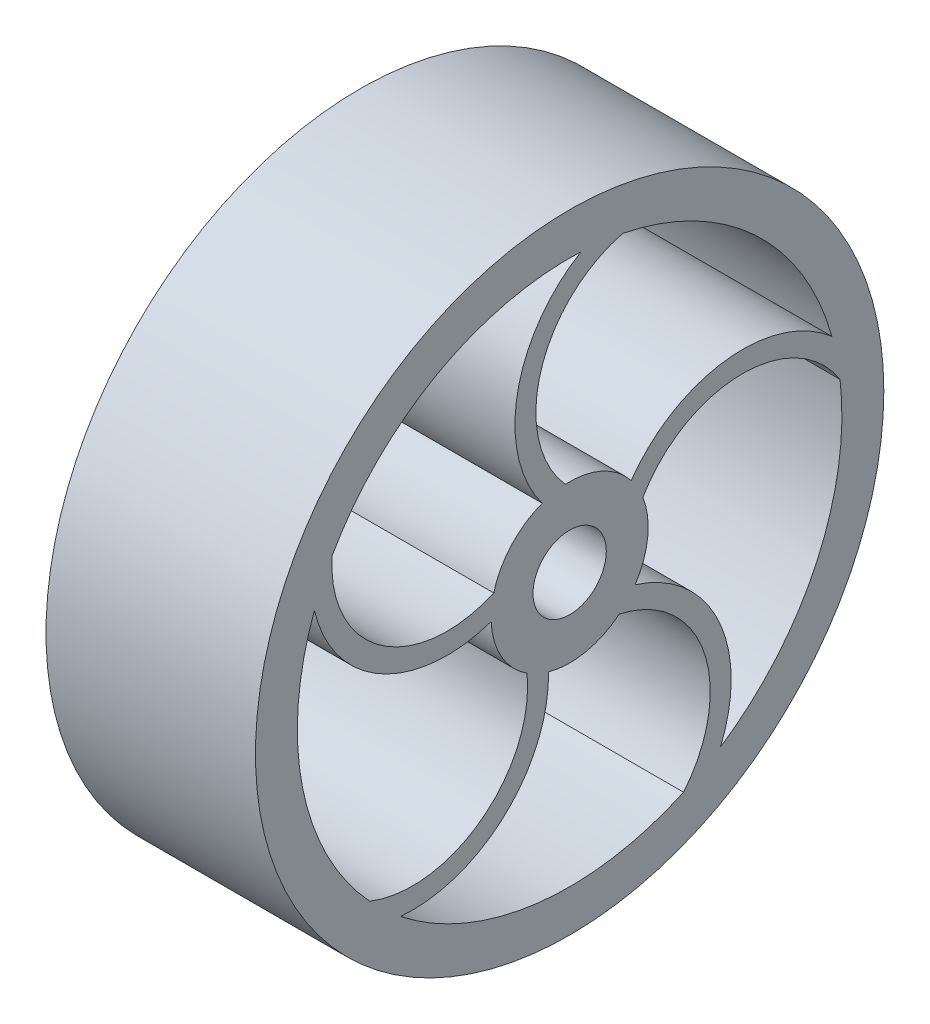
ISO-10303-21;
HEADER;
FILE_DESCRIPTION(('STEP AP214'),'2;1');
FILE_NAME('part.step','',(''),(''),'','','');
FILE_SCHEMA(('AUTOMOTIVE_DESIGN { 1 0 10303 214 1 1 1 1 }'));
ENDSEC;
DATA;
#1=APPLICATION_CONTEXT('core data for automotive mechanical design processes');
#2=APPLICATION_PROTOCOL_DEFINITION('international standard','automotive_design',2000,#1);
#3=PRODUCT_CONTEXT('',#1,'mechanical');
#4=PRODUCT('Part','Part','',(#3));
#5=PRODUCT_RELATED_PRODUCT_CATEGORY('part','',(#4));
#6=PRODUCT_DEFINITION_FORMATION('','',#4);
#7=PRODUCT_DEFINITION_CONTEXT('part definition',#1,'design');
#8=PRODUCT_DEFINITION('design','',#6,#7);
#9=PRODUCT_DEFINITION_SHAPE('','',#8);
#10=(LENGTH_UNIT() NAMED_UNIT(*) SI_UNIT(.MILLI.,.METRE.));
#11=(NAMED_UNIT(*) PLANE_ANGLE_UNIT() SI_UNIT($,.RADIAN.));
#12=(NAMED_UNIT(*) SI_UNIT($,.STERADIAN.) SOLID_ANGLE_UNIT());
#13=UNCERTAINTY_MEASURE_WITH_UNIT(LENGTH_MEASURE(1.E-05),#10,'distance_accuracy_value','');
#14=(GEOMETRIC_REPRESENTATION_CONTEXT(3) GLOBAL_UNCERTAINTY_ASSIGNED_CONTEXT((#13)) GLOBAL_UNIT_ASSIGNED_CONTEXT((#10,
#11,#12)) REPRESENTATION_CONTEXT('',''));
#15=CARTESIAN_POINT('',(0.,0.,0.));
#16=DIRECTION('',(0.,0.,1.));
#17=DIRECTION('',(1.,0.,0.));
#18=AXIS2_PLACEMENT_3D('',#15,#16,#17);
#19=CARTESIAN_POINT('',(-20.6066017177982,0.,0.));
#20=DIRECTION('',(1.,0.,0.));
#21=DIRECTION('',(0.,0.,-1.));
#22=AXIS2_PLACEMENT_3D('',#19,#20,#21);
#23=CYLINDRICAL_SURFACE('',#22,3.75);
#24=DIRECTION('',(1.,0.,0.));
#25=VECTOR('',#24,1.);
#26=CARTESIAN_POINT('',(-21.1056734173253,-2.90881639431108,-2.36670386491151));
#27=LINE('',#26,#25);
#28=CARTESIAN_POINT('',(-10.,-2.90881639431108,-2.36670386491151));
#29=VERTEX_POINT('',#28);
#30=CARTESIAN_POINT('',(0.,-2.90881639431108,-2.36670386491151));
#31=VERTEX_POINT('',#30);
#32=EDGE_CURVE('E72',#29,#31,#27,.T.);
#33=ORIENTED_EDGE('',*,*,#32,.T.);
#34=CARTESIAN_POINT('',(0.,0.,0.));
#35=DIRECTION('',(1.,0.,0.));
#36=DIRECTION('',(0.,0.,-1.));
#37=AXIS2_PLACEMENT_3D('',#34,#35,#36);
#38=CIRCLE('',#37,3.75);
#39=CARTESIAN_POINT('',(0.,-3.61232318996638,1.00678755019671));
#40=VERTEX_POINT('',#39);
#41=EDGE_CURVE('E228',#40,#31,#38,.T.);
#42=ORIENTED_EDGE('',*,*,#41,.F.);
#43=DIRECTION('',(1.,0.,0.));
#44=VECTOR('',#43,1.);
#45=CARTESIAN_POINT('',(-21.0859827786348,-3.61232318996638,1.00678755019671));
#46=LINE('',#45,#44);
#47=CARTESIAN_POINT('',(-10.,-3.61232318996638,1.00678755019671));
#48=VERTEX_POINT('',#47);
#49=EDGE_CURVE('E301',#48,#40,#46,.T.);
#50=ORIENTED_EDGE('',*,*,#49,.F.);
#51=CARTESIAN_POINT('',(-10.,0.,0.));
#52=DIRECTION('',(1.,0.,0.));
#53=DIRECTION('',(0.,0.,-1.));
#54=AXIS2_PLACEMENT_3D('',#51,#52,#53);
#55=CIRCLE('',#54,3.75);
#56=EDGE_CURVE('E369',#29,#48,#55,.F.);
#57=ORIENTED_EDGE('',*,*,#56,.F.);
#58=EDGE_LOOP('',(#33,#42,#50,#57));
#59=FACE_BOUND('',#58,.T.);
#60=ADVANCED_FACE('F45',(#59),#23,.T.);
#61=DIRECTION('',(1.,0.,0.));
#62=VECTOR('',#61,1.);
#63=CARTESIAN_POINT('',(-21.1056734173253,-2.07378111501374,-3.12440904604573));
#64=LINE('',#63,#62);
#65=CARTESIAN_POINT('',(-10.,-2.07378111501374,-3.12440904604573));
#66=VERTEX_POINT('',#65);
#67=CARTESIAN_POINT('',(0.,-2.07378111501374,-3.12440904604573));
#68=VERTEX_POINT('',#67);
#69=EDGE_CURVE('E257',#66,#68,#64,.T.);
#70=ORIENTED_EDGE('',*,*,#69,.F.);
#71=CARTESIAN_POINT('',(-10.,1.35199543350645,-3.49780050142625));
#72=VERTEX_POINT('',#71);
#73=EDGE_CURVE('E260',#72,#66,#55,.F.);
#74=ORIENTED_EDGE('',*,*,#73,.F.);
#75=DIRECTION('',(1.,0.,0.));
#76=VECTOR('',#75,1.);
#77=CARTESIAN_POINT('',(-20.6513714557364,1.35199543350645,-3.49780050142625));
#78=LINE('',#77,#76);
#79=CARTESIAN_POINT('',(0.,1.35199543350645,-3.49780050142625));
#80=VERTEX_POINT('',#79);
#81=EDGE_CURVE('E259',#72,#80,#78,.T.);
#82=ORIENTED_EDGE('',*,*,#81,.T.);
#83=EDGE_CURVE('E222',#68,#80,#38,.T.);
#84=ORIENTED_EDGE('',*,*,#83,.F.);
#85=EDGE_LOOP('',(#70,#74,#82,#84));
#86=FACE_BOUND('',#85,.T.);
#87=ADVANCED_FACE('F255',(#86),#23,.T.);
#88=DIRECTION('',(1.,0.,0.));
#89=VECTOR('',#88,1.);
#90=CARTESIAN_POINT('',(-20.6513714557364,2.33065597566025,-2.93777853541059));
#91=LINE('',#90,#89);
#92=CARTESIAN_POINT('',(-10.,2.33065597566025,-2.93777853541059));
#93=VERTEX_POINT('',#92);
#94=CARTESIAN_POINT('',(0.,2.33065597566025,-2.93777853541059));
#95=VERTEX_POINT('',#94);
#96=EDGE_CURVE('E266',#93,#95,#91,.T.);
#97=ORIENTED_EDGE('',*,*,#96,.F.);
#98=CARTESIAN_POINT('',(-10.,3.7443955248527,0.204944269163687));
#99=VERTEX_POINT('',#98);
#100=EDGE_CURVE('E55',#99,#93,#55,.F.);
#101=ORIENTED_EDGE('',*,*,#100,.F.);
#102=DIRECTION('',(1.,0.,0.));
#103=VECTOR('',#102,1.);
#104=CARTESIAN_POINT('',(-20.7843497110714,3.74439552485271,0.204944269163687));
#105=LINE('',#104,#103);
#106=CARTESIAN_POINT('',(0.,3.74439552485271,0.204944269163687));
#107=VERTEX_POINT('',#106);
#108=EDGE_CURVE('E199',#99,#107,#105,.T.);
#109=ORIENTED_EDGE('',*,*,#108,.T.);
#110=EDGE_CURVE('E216',#95,#107,#38,.T.);
#111=ORIENTED_EDGE('',*,*,#110,.F.);
#112=EDGE_LOOP('',(#97,#101,#109,#111));
#113=FACE_BOUND('',#112,.T.);
#114=ADVANCED_FACE('F389',(#113),#23,.T.);
#115=DIRECTION('',(1.,0.,0.));
#116=VECTOR('',#115,1.);
#117=CARTESIAN_POINT('',(-21.0859827786348,-3.1497428322236,2.03509707160521));
#118=LINE('',#117,#116);
#119=CARTESIAN_POINT('',(-10.,-3.1497428322236,2.0350970716052));
#120=VERTEX_POINT('',#119);
#121=CARTESIAN_POINT('',(0.,-3.1497428322236,2.03509707160521));
#122=VERTEX_POINT('',#121);
#123=EDGE_CURVE('E64',#120,#122,#118,.T.);
#124=ORIENTED_EDGE('',*,*,#123,.T.);
#125=CARTESIAN_POINT('',(0.,-0.15875739473491,3.74663797151753));
#126=VERTEX_POINT('',#125);
#127=EDGE_CURVE('E218',#126,#122,#38,.T.);
#128=ORIENTED_EDGE('',*,*,#127,.F.);
#129=DIRECTION('',(1.,0.,0.));
#130=VECTOR('',#129,1.);
#131=CARTESIAN_POINT('',(-20.9738852147441,-0.15875739473491,3.74663797151753));
#132=LINE('',#131,#130);
#133=CARTESIAN_POINT('',(-10.,-0.15875739473491,3.74663797151753));
#134=VERTEX_POINT('',#133);
#135=EDGE_CURVE('E343',#134,#126,#132,.T.);
#136=ORIENTED_EDGE('',*,*,#135,.F.);
#137=EDGE_CURVE('E57',#120,#134,#55,.F.);
#138=ORIENTED_EDGE('',*,*,#137,.F.);
#139=EDGE_LOOP('',(#124,#128,#136,#138));
#140=FACE_BOUND('',#139,.T.);
#141=ADVANCED_FACE('F367',(#140),#23,.T.);
#142=CARTESIAN_POINT('',(-52.4264068711929,0.,0.));
#143=DIRECTION('',(1.,0.,0.));
#144=DIRECTION('',(0.,0.,-1.));
#145=AXIS2_PLACEMENT_3D('',#142,#143,#144);
#146=CYLINDRICAL_SURFACE('',#145,13.);
#147=CARTESIAN_POINT('',(0.,0.,0.));
#148=DIRECTION('',(1.,0.,0.));
#149=DIRECTION('',(0.,0.,-1.));
#150=AXIS2_PLACEMENT_3D('',#147,#148,#149);
#151=CIRCLE('',#150,13.);
#152=CARTESIAN_POINT('',(0.,-10.1902613710243,8.07208604947997));
#153=VERTEX_POINT('',#152);
#154=CARTESIAN_POINT('',(0.,-11.8075373648667,-5.43893936142667));
#155=VERTEX_POINT('',#154);
#156=EDGE_CURVE('E319',#153,#155,#151,.T.);
#157=ORIENTED_EDGE('',*,*,#156,.T.);
#158=DIRECTION('',(1.,0.,0.));
#159=VECTOR('',#158,1.);
#160=CARTESIAN_POINT('',(-21.1056734173253,-11.8075373648667,-5.43893936142667));
#161=LINE('',#160,#159);
#162=CARTESIAN_POINT('',(-10.,-11.8075373648667,-5.43893936142667));
#163=VERTEX_POINT('',#162);
#164=EDGE_CURVE('E418',#163,#155,#161,.T.);
#165=ORIENTED_EDGE('',*,*,#164,.F.);
#166=CARTESIAN_POINT('',(-10.,0.,0.));
#167=DIRECTION('',(1.,0.,0.));
#168=DIRECTION('',(0.,0.,-1.));
#169=AXIS2_PLACEMENT_3D('',#166,#167,#168);
#170=CIRCLE('',#169,13.);
#171=CARTESIAN_POINT('',(-10.,-10.1902613710243,8.07208604947997));
#172=VERTEX_POINT('',#171);
#173=EDGE_CURVE('E671',#163,#172,#170,.F.);
#174=ORIENTED_EDGE('',*,*,#173,.T.);
#175=DIRECTION('',(1.,0.,0.));
#176=VECTOR('',#175,1.);
#177=CARTESIAN_POINT('',(-21.0859827786348,-10.1902613710243,8.07208604947997));
#178=LINE('',#177,#176);
#179=EDGE_CURVE('E295',#172,#153,#178,.T.);
#180=ORIENTED_EDGE('',*,*,#179,.T.);
#181=EDGE_LOOP('',(#157,#165,#174,#180));
#182=FACE_BOUND('',#181,.T.);
#183=ADVANCED_FACE('F479',(#182),#146,.F.);
#184=CARTESIAN_POINT('',(-10.,1.52400901395807,-12.9103600463107));
#185=VERTEX_POINT('',#184);
#186=CARTESIAN_POINT('',(-10.,-10.8259739782222,-7.19710271031727));
#187=VERTEX_POINT('',#186);
#188=EDGE_CURVE('E668',#185,#187,#170,.F.);
#189=ORIENTED_EDGE('',*,*,#188,.T.);
#190=DIRECTION('',(1.,0.,0.));
#191=VECTOR('',#190,1.);
#192=CARTESIAN_POINT('',(-21.1056734173253,-10.8259739782222,-7.19710271031727));
#193=LINE('',#192,#191);
#194=CARTESIAN_POINT('',(0.,-10.8259739782222,-7.19710271031727));
#195=VERTEX_POINT('',#194);
#196=EDGE_CURVE('E410',#187,#195,#193,.T.);
#197=ORIENTED_EDGE('',*,*,#196,.T.);
#198=CARTESIAN_POINT('',(0.,1.52400901395807,-12.9103600463107));
#199=VERTEX_POINT('',#198);
#200=EDGE_CURVE('E445',#195,#199,#151,.T.);
#201=ORIENTED_EDGE('',*,*,#200,.T.);
#202=DIRECTION('',(1.,0.,0.));
#203=VECTOR('',#202,1.);
#204=CARTESIAN_POINT('',(-20.6513714557364,1.52400901395807,-12.9103600463107));
#205=LINE('',#204,#203);
#206=EDGE_CURVE('E265',#185,#199,#205,.T.);
#207=ORIENTED_EDGE('',*,*,#206,.F.);
#208=EDGE_LOOP('',(#189,#197,#201,#207));
#209=FACE_BOUND('',#208,.T.);
#210=ADVANCED_FACE('F484',(#209),#146,.F.);
#211=CARTESIAN_POINT('',(-10.,12.749426734654,-2.54010195419192));
#212=VERTEX_POINT('',#211);
#213=CARTESIAN_POINT('',(-10.,3.49944149116118,-12.52014014498));
#214=VERTEX_POINT('',#213);
#215=EDGE_CURVE('E326',#212,#214,#170,.F.);
#216=ORIENTED_EDGE('',*,*,#215,.T.);
#217=DIRECTION('',(1.,0.,0.));
#218=VECTOR('',#217,1.);
#219=CARTESIAN_POINT('',(-20.6513714557364,3.49944149116118,-12.52014014498));
#220=LINE('',#219,#218);
#221=CARTESIAN_POINT('',(0.,3.49944149116118,-12.52014014498));
#222=VERTEX_POINT('',#221);
#223=EDGE_CURVE('E273',#214,#222,#220,.T.);
#224=ORIENTED_EDGE('',*,*,#223,.T.);
#225=CARTESIAN_POINT('',(0.,12.749426734654,-2.54010195419192));
#226=VERTEX_POINT('',#225);
#227=EDGE_CURVE('E398',#222,#226,#151,.T.);
#228=ORIENTED_EDGE('',*,*,#227,.T.);
#229=DIRECTION('',(1.,0.,0.));
#230=VECTOR('',#229,1.);
#231=CARTESIAN_POINT('',(-20.7843497110714,12.749426734654,-2.54010195419192));
#232=LINE('',#231,#230);
#233=EDGE_CURVE('E432',#212,#226,#232,.T.);
#234=ORIENTED_EDGE('',*,*,#233,.F.);
#235=EDGE_LOOP('',(#216,#224,#228,#234));
#236=FACE_BOUND('',#235,.T.);
#237=ADVANCED_FACE('F443',(#236),#146,.F.);
#238=CARTESIAN_POINT('',(0.,4.52804609668409,12.1859262490097));
#239=VERTEX_POINT('',#238);
#240=CARTESIAN_POINT('',(0.,-8.82146842888001,9.54891065819936));
#241=VERTEX_POINT('',#240);
#242=EDGE_CURVE('E315',#239,#241,#151,.T.);
#243=ORIENTED_EDGE('',*,*,#242,.T.);
#244=DIRECTION('',(1.,0.,0.));
#245=VECTOR('',#244,1.);
#246=CARTESIAN_POINT('',(-21.0859827786348,-8.82146842888001,9.54891065819936));
#247=LINE('',#246,#245);
#248=CARTESIAN_POINT('',(-10.,-8.82146842888001,9.54891065819936));
#249=VERTEX_POINT('',#248);
#250=EDGE_CURVE('E287',#249,#241,#247,.T.);
#251=ORIENTED_EDGE('',*,*,#250,.F.);
#252=CARTESIAN_POINT('',(-10.,4.52804609668409,12.1859262490097));
#253=VERTEX_POINT('',#252);
#254=EDGE_CURVE('E323',#249,#253,#170,.F.);
#255=ORIENTED_EDGE('',*,*,#254,.T.);
#256=DIRECTION('',(1.,0.,0.));
#257=VECTOR('',#256,1.);
#258=CARTESIAN_POINT('',(-20.9738852147441,4.52804609668409,12.1859262490097));
#259=LINE('',#258,#257);
#260=EDGE_CURVE('E337',#253,#239,#259,.T.);
#261=ORIENTED_EDGE('',*,*,#260,.T.);
#262=EDGE_LOOP('',(#243,#251,#255,#261));
#263=FACE_BOUND('',#262,.T.);
#264=ADVANCED_FACE('F363',(#263),#146,.F.);
#265=DIRECTION('',(1.,0.,0.));
#266=VECTOR('',#265,1.);
#267=CARTESIAN_POINT('',(-20.7843497110714,3.51420572405481,1.30876205974211));
#268=LINE('',#267,#266);
#269=CARTESIAN_POINT('',(-10.,3.51420572405481,1.30876205974211));
#270=VERTEX_POINT('',#269);
#271=CARTESIAN_POINT('',(0.,3.51420572405481,1.30876205974211));
#272=VERTEX_POINT('',#271);
#273=EDGE_CURVE('E188',#270,#272,#268,.T.);
#274=ORIENTED_EDGE('',*,*,#273,.F.);
#275=CARTESIAN_POINT('',(-10.,0.962168268175556,3.6244630255689));
#276=VERTEX_POINT('',#275);
#277=EDGE_CURVE('E11',#276,#270,#55,.F.);
#278=ORIENTED_EDGE('',*,*,#277,.F.);
#279=DIRECTION('',(1.,0.,0.));
#280=VECTOR('',#279,1.);
#281=CARTESIAN_POINT('',(-20.9738852147441,0.962168268175556,3.6244630255689));
#282=LINE('',#281,#280);
#283=CARTESIAN_POINT('',(0.,0.962168268175556,3.6244630255689));
#284=VERTEX_POINT('',#283);
#285=EDGE_CURVE('E214',#276,#284,#282,.T.);
#286=ORIENTED_EDGE('',*,*,#285,.T.);
#287=EDGE_CURVE('E207',#272,#284,#38,.T.);
#288=ORIENTED_EDGE('',*,*,#287,.F.);
#289=EDGE_LOOP('',(#274,#278,#286,#288));
#290=FACE_BOUND('',#289,.T.);
#291=ADVANCED_FACE('F47',(#290),#23,.T.);
#292=CARTESIAN_POINT('',(0.,0.,0.));
#293=DIRECTION('',(1.,0.,0.));
#294=DIRECTION('',(0.,0.,-1.));
#295=AXIS2_PLACEMENT_3D('',#292,#293,#294);
#296=PLANE('',#295);
#297=ORIENTED_EDGE('',*,*,#41,.T.);
#298=CARTESIAN_POINT('',(0.,-8.28659443166286,-1.21366293720046));
#299=DIRECTION('',(-1.,0.,0.));
#300=DIRECTION('',(0.,0.587785252292469,0.809016994374951));
#301=AXIS2_PLACEMENT_3D('',#298,#299,#300);
#302=CIRCLE('',#301,5.5);
#303=EDGE_CURVE('E413',#31,#155,#302,.T.);
#304=ORIENTED_EDGE('',*,*,#303,.T.);
#305=ORIENTED_EDGE('',*,*,#156,.F.);
#306=CARTESIAN_POINT('',(0.,-3.71496054988702,7.50597715909016));
#307=DIRECTION('',(1.,0.,0.));
#308=DIRECTION('',(0.,0.951056516295155,-0.309016994374945));
#309=AXIS2_PLACEMENT_3D('',#306,#307,#308);
#310=CIRCLE('',#309,6.5);
#311=EDGE_CURVE('E288',#153,#40,#310,.T.);
#312=ORIENTED_EDGE('',*,*,#311,.T.);
#313=EDGE_LOOP('',(#297,#304,#305,#312));
#314=FACE_BOUND('',#313,.T.);
#315=ORIENTED_EDGE('',*,*,#83,.T.);
#316=CARTESIAN_POINT('',(0.,-1.4064364598662,-8.25606210516606));
#317=DIRECTION('',(-1.,0.,0.));
#318=DIRECTION('',(0.,-0.58778525229248,0.809016994374942));
#319=AXIS2_PLACEMENT_3D('',#316,#317,#318);
#320=CIRCLE('',#319,5.5);
#321=EDGE_CURVE('E249',#80,#199,#320,.T.);
#322=ORIENTED_EDGE('',*,*,#321,.T.);
#323=ORIENTED_EDGE('',*,*,#200,.F.);
#324=CARTESIAN_POINT('',(0.,-8.28659443166286,-1.21366293720046));
#325=DIRECTION('',(1.,0.,0.));
#326=DIRECTION('',(0.,0.587785252292469,0.809016994374951));
#327=AXIS2_PLACEMENT_3D('',#324,#325,#326);
#328=CIRCLE('',#327,6.5);
#329=EDGE_CURVE('E251',#195,#68,#328,.T.);
#330=ORIENTED_EDGE('',*,*,#329,.T.);
#331=EDGE_LOOP('',(#315,#322,#323,#330));
#332=FACE_BOUND('',#331,.T.);
#333=ORIENTED_EDGE('',*,*,#110,.T.);
#334=CARTESIAN_POINT('',(0.,7.41736889644848,-3.88886405702213));
#335=DIRECTION('',(-1.,0.,0.));
#336=DIRECTION('',(0.,-0.95105651629515,-0.309016994374958));
#337=AXIS2_PLACEMENT_3D('',#334,#335,#336);
#338=CIRCLE('',#337,5.5);
#339=EDGE_CURVE('E211',#107,#226,#338,.T.);
#340=ORIENTED_EDGE('',*,*,#339,.T.);
#341=ORIENTED_EDGE('',*,*,#227,.F.);
#342=CARTESIAN_POINT('',(0.,-1.4064364598662,-8.25606210516606));
#343=DIRECTION('',(1.,0.,0.));
#344=DIRECTION('',(0.,-0.58778525229248,0.809016994374942));
#345=AXIS2_PLACEMENT_3D('',#342,#343,#344);
#346=CIRCLE('',#345,6.5);
#347=EDGE_CURVE('E395',#222,#95,#346,.T.);
#348=ORIENTED_EDGE('',*,*,#347,.T.);
#349=EDGE_LOOP('',(#333,#340,#341,#348));
#350=FACE_BOUND('',#349,.T.);
#351=ORIENTED_EDGE('',*,*,#127,.T.);
#352=CARTESIAN_POINT('',(0.,-3.71496054988702,7.50597715909016));
#353=DIRECTION('',(-1.,0.,0.));
#354=DIRECTION('',(0.,0.951056516295155,-0.309016994374945));
#355=AXIS2_PLACEMENT_3D('',#352,#353,#354);
#356=CIRCLE('',#355,5.5);
#357=EDGE_CURVE('E291',#122,#241,#356,.T.);
#358=ORIENTED_EDGE('',*,*,#357,.T.);
#359=ORIENTED_EDGE('',*,*,#242,.F.);
#360=CARTESIAN_POINT('',(0.,5.9906225449677,5.85261194029851));
#361=DIRECTION('',(1.,0.,0.));
#362=DIRECTION('',(0.,0.,-1.));
#363=AXIS2_PLACEMENT_3D('',#360,#361,#362);
#364=CIRCLE('',#363,6.5);
#365=EDGE_CURVE('E313',#239,#126,#364,.T.);
#366=ORIENTED_EDGE('',*,*,#365,.T.);
#367=EDGE_LOOP('',(#351,#358,#359,#366));
#368=FACE_BOUND('',#367,.T.);
#369=CARTESIAN_POINT('',(0.,0.,0.));
#370=DIRECTION('',(1.,0.,0.));
#371=DIRECTION('',(0.,0.,-1.));
#372=AXIS2_PLACEMENT_3D('',#369,#370,#371);
#373=CIRCLE('',#372,1.75);
#374=CARTESIAN_POINT('',(0.,0.,-1.75));
#375=VERTEX_POINT('',#374);
#376=EDGE_CURVE('E217',#375,#375,#373,.T.);
#377=ORIENTED_EDGE('',*,*,#376,.F.);
#378=EDGE_LOOP('',(#377));
#379=FACE_BOUND('',#378,.T.);
#380=CARTESIAN_POINT('',(0.,7.41736889644848,-3.88886405702213));
#381=DIRECTION('',(1.,0.,0.));
#382=DIRECTION('',(0.,-0.95105651629515,-0.309016994374958));
#383=AXIS2_PLACEMENT_3D('',#380,#381,#382);
#384=CIRCLE('',#383,6.5);
#385=CARTESIAN_POINT('',(0.,12.9887477614014,-0.540769443192334));
#386=VERTEX_POINT('',#385);
#387=EDGE_CURVE('E192',#386,#272,#384,.T.);
#388=ORIENTED_EDGE('',*,*,#387,.T.);
#389=ORIENTED_EDGE('',*,*,#287,.T.);
#390=CARTESIAN_POINT('',(0.,5.9906225449677,5.85261194029851));
#391=DIRECTION('',(-1.,0.,0.));
#392=DIRECTION('',(0.,0.,-1.));
#393=AXIS2_PLACEMENT_3D('',#390,#391,#392);
#394=CIRCLE('',#393,5.5);
#395=CARTESIAN_POINT('',(0.,6.35557004513479,11.3404907037299));
#396=VERTEX_POINT('',#395);
#397=EDGE_CURVE('E334',#284,#396,#394,.T.);
#398=ORIENTED_EDGE('',*,*,#397,.T.);
#399=EDGE_CURVE('E209',#386,#396,#151,.T.);
#400=ORIENTED_EDGE('',*,*,#399,.F.);
#401=EDGE_LOOP('',(#388,#389,#398,#400));
#402=FACE_BOUND('',#401,.T.);
#403=CARTESIAN_POINT('',(0.,0.,0.));
#404=DIRECTION('',(1.,0.,0.));
#405=DIRECTION('',(0.,0.,-1.));
#406=AXIS2_PLACEMENT_3D('',#403,#404,#405);
#407=CIRCLE('',#406,15.);
#408=CARTESIAN_POINT('',(0.,0.,-15.));
#409=VERTEX_POINT('',#408);
#410=EDGE_CURVE('E318',#409,#409,#407,.T.);
#411=ORIENTED_EDGE('',*,*,#410,.T.);
#412=EDGE_LOOP('',(#411));
#413=FACE_BOUND('',#412,.T.);
#414=ADVANCED_FACE('F204',(#314,#332,#350,#368,#379,#402,#413),#296,.T.);
#415=CARTESIAN_POINT('',(-20.6066017177982,0.,0.));
#416=DIRECTION('',(1.,0.,0.));
#417=DIRECTION('',(0.,0.,-1.));
#418=AXIS2_PLACEMENT_3D('',#415,#416,#417);
#419=CYLINDRICAL_SURFACE('',#418,1.75);
#420=CARTESIAN_POINT('',(-10.,0.,0.));
#421=DIRECTION('',(1.,0.,0.));
#422=DIRECTION('',(0.,0.,-1.));
#423=AXIS2_PLACEMENT_3D('',#420,#421,#422);
#424=CIRCLE('',#423,1.75);
#425=CARTESIAN_POINT('',(-10.,0.,-1.75));
#426=VERTEX_POINT('',#425);
#427=EDGE_CURVE('E49',#426,#426,#424,.F.);
#428=ORIENTED_EDGE('',*,*,#427,.T.);
#429=EDGE_LOOP('',(#428));
#430=FACE_BOUND('',#429,.T.);
#431=ORIENTED_EDGE('',*,*,#376,.T.);
#432=EDGE_LOOP('',(#431));
#433=FACE_BOUND('',#432,.T.);
#434=ADVANCED_FACE('F455',(#430,#433),#419,.F.);
#435=CARTESIAN_POINT('',(-10.,0.,0.));
#436=DIRECTION('',(1.,0.,0.));
#437=DIRECTION('',(0.,0.,-1.));
#438=AXIS2_PLACEMENT_3D('',#435,#436,#437);
#439=PLANE('',#438);
#440=ORIENTED_EDGE('',*,*,#73,.T.);
#441=CARTESIAN_POINT('',(-10.,-8.28659443166286,-1.21366293720046));
#442=DIRECTION('',(1.,0.,0.));
#443=DIRECTION('',(0.,0.,-1.));
#444=AXIS2_PLACEMENT_3D('',#441,#442,#443);
#445=CIRCLE('',#444,6.5);
#446=EDGE_CURVE('E292',#66,#187,#445,.F.);
#447=ORIENTED_EDGE('',*,*,#446,.T.);
#448=ORIENTED_EDGE('',*,*,#188,.F.);
#449=CARTESIAN_POINT('',(-10.,-1.4064364598662,-8.25606210516606));
#450=DIRECTION('',(1.,0.,0.));
#451=DIRECTION('',(0.,0.,-1.));
#452=AXIS2_PLACEMENT_3D('',#449,#450,#451);
#453=CIRCLE('',#452,5.5);
#454=EDGE_CURVE('E271',#185,#72,#453,.T.);
#455=ORIENTED_EDGE('',*,*,#454,.T.);
#456=EDGE_LOOP('',(#440,#447,#448,#455));
#457=FACE_BOUND('',#456,.T.);
#458=ORIENTED_EDGE('',*,*,#100,.T.);
#459=CARTESIAN_POINT('',(-10.,-1.4064364598662,-8.25606210516606));
#460=DIRECTION('',(1.,0.,0.));
#461=DIRECTION('',(0.,0.,-1.));
#462=AXIS2_PLACEMENT_3D('',#459,#460,#461);
#463=CIRCLE('',#462,6.5);
#464=EDGE_CURVE('E279',#93,#214,#463,.F.);
#465=ORIENTED_EDGE('',*,*,#464,.T.);
#466=ORIENTED_EDGE('',*,*,#215,.F.);
#467=CARTESIAN_POINT('',(-10.,7.41736889644848,-3.88886405702213));
#468=DIRECTION('',(1.,0.,0.));
#469=DIRECTION('',(0.,0.,-1.));
#470=AXIS2_PLACEMENT_3D('',#467,#468,#469);
#471=CIRCLE('',#470,5.5);
#472=EDGE_CURVE('E385',#212,#99,#471,.T.);
#473=ORIENTED_EDGE('',*,*,#472,.T.);
#474=EDGE_LOOP('',(#458,#465,#466,#473));
#475=FACE_BOUND('',#474,.T.);
#476=ORIENTED_EDGE('',*,*,#277,.T.);
#477=CARTESIAN_POINT('',(-10.,7.41736889644848,-3.88886405702213));
#478=DIRECTION('',(1.,0.,0.));
#479=DIRECTION('',(0.,0.,-1.));
#480=AXIS2_PLACEMENT_3D('',#477,#478,#479);
#481=CIRCLE('',#480,6.5);
#482=CARTESIAN_POINT('',(-10.,12.9887477614014,-0.540769443192334));
#483=VERTEX_POINT('',#482);
#484=EDGE_CURVE('E194',#270,#483,#481,.F.);
#485=ORIENTED_EDGE('',*,*,#484,.T.);
#486=CARTESIAN_POINT('',(-10.,6.35557004513479,11.3404907037299));
#487=VERTEX_POINT('',#486);
#488=EDGE_CURVE('E314',#487,#483,#170,.F.);
#489=ORIENTED_EDGE('',*,*,#488,.F.);
#490=CARTESIAN_POINT('',(-10.,5.9906225449677,5.85261194029851));
#491=DIRECTION('',(1.,0.,0.));
#492=DIRECTION('',(0.,0.,-1.));
#493=AXIS2_PLACEMENT_3D('',#490,#491,#492);
#494=CIRCLE('',#493,5.5);
#495=EDGE_CURVE('E327',#487,#276,#494,.T.);
#496=ORIENTED_EDGE('',*,*,#495,.T.);
#497=EDGE_LOOP('',(#476,#485,#489,#496));
#498=FACE_BOUND('',#497,.T.);
#499=ORIENTED_EDGE('',*,*,#56,.T.);
#500=CARTESIAN_POINT('',(-10.,-3.71496054988702,7.50597715909016));
#501=DIRECTION('',(1.,0.,0.));
#502=DIRECTION('',(0.,0.,-1.));
#503=AXIS2_PLACEMENT_3D('',#500,#501,#502);
#504=CIRCLE('',#503,6.5);
#505=EDGE_CURVE('E286',#48,#172,#504,.F.);
#506=ORIENTED_EDGE('',*,*,#505,.T.);
#507=ORIENTED_EDGE('',*,*,#173,.F.);
#508=CARTESIAN_POINT('',(-10.,-8.28659443166286,-1.21366293720046));
#509=DIRECTION('',(1.,0.,0.));
#510=DIRECTION('',(0.,0.,-1.));
#511=AXIS2_PLACEMENT_3D('',#508,#509,#510);
#512=CIRCLE('',#511,5.5);
#513=EDGE_CURVE('E409',#163,#29,#512,.T.);
#514=ORIENTED_EDGE('',*,*,#513,.T.);
#515=EDGE_LOOP('',(#499,#506,#507,#514));
#516=FACE_BOUND('',#515,.T.);
#517=CARTESIAN_POINT('',(-10.,-3.71496054988702,7.50597715909016));
#518=DIRECTION('',(1.,0.,0.));
#519=DIRECTION('',(0.,0.,-1.));
#520=AXIS2_PLACEMENT_3D('',#517,#518,#519);
#521=CIRCLE('',#520,5.5);
#522=EDGE_CURVE('E283',#249,#120,#521,.T.);
#523=ORIENTED_EDGE('',*,*,#522,.T.);
#524=ORIENTED_EDGE('',*,*,#137,.T.);
#525=CARTESIAN_POINT('',(-10.,5.9906225449677,5.85261194029851));
#526=DIRECTION('',(1.,0.,0.));
#527=DIRECTION('',(0.,0.,-1.));
#528=AXIS2_PLACEMENT_3D('',#525,#526,#527);
#529=CIRCLE('',#528,6.5);
#530=EDGE_CURVE('E224',#134,#253,#529,.F.);
#531=ORIENTED_EDGE('',*,*,#530,.T.);
#532=ORIENTED_EDGE('',*,*,#254,.F.);
#533=EDGE_LOOP('',(#523,#524,#531,#532));
#534=FACE_BOUND('',#533,.T.);
#535=ORIENTED_EDGE('',*,*,#427,.F.);
#536=EDGE_LOOP('',(#535));
#537=FACE_BOUND('',#536,.T.);
#538=CARTESIAN_POINT('',(-10.,0.,0.));
#539=DIRECTION('',(1.,0.,0.));
#540=DIRECTION('',(0.,0.,-1.));
#541=AXIS2_PLACEMENT_3D('',#538,#539,#540);
#542=CIRCLE('',#541,15.);
#543=CARTESIAN_POINT('',(-10.,0.,-15.));
#544=VERTEX_POINT('',#543);
#545=EDGE_CURVE('E309',#544,#544,#542,.F.);
#546=ORIENTED_EDGE('',*,*,#545,.T.);
#547=EDGE_LOOP('',(#546));
#548=FACE_BOUND('',#547,.T.);
#549=ADVANCED_FACE('F354',(#457,#475,#498,#516,#534,#537,#548),#439,.F.);
#550=CARTESIAN_POINT('',(-20.9738852147441,5.9906225449677,5.85261194029851));
#551=DIRECTION('',(1.,0.,0.));
#552=DIRECTION('',(0.,0.,-1.));
#553=AXIS2_PLACEMENT_3D('',#550,#551,#552);
#554=CYLINDRICAL_SURFACE('',#553,5.5);
#555=ORIENTED_EDGE('',*,*,#495,.F.);
#556=DIRECTION('',(1.,0.,0.));
#557=VECTOR('',#556,1.);
#558=CARTESIAN_POINT('',(-20.9738852147441,6.35557004513479,11.3404907037299));
#559=LINE('',#558,#557);
#560=EDGE_CURVE('E331',#487,#396,#559,.T.);
#561=ORIENTED_EDGE('',*,*,#560,.T.);
#562=ORIENTED_EDGE('',*,*,#397,.F.);
#563=ORIENTED_EDGE('',*,*,#285,.F.);
#564=EDGE_LOOP('',(#555,#561,#562,#563));
#565=FACE_BOUND('',#564,.T.);
#566=ADVANCED_FACE('F453',(#565),#554,.F.);
#567=CARTESIAN_POINT('',(-20.9738852147441,5.9906225449677,5.85261194029851));
#568=DIRECTION('',(1.,0.,0.));
#569=DIRECTION('',(0.,0.,-1.));
#570=AXIS2_PLACEMENT_3D('',#567,#568,#569);
#571=CYLINDRICAL_SURFACE('',#570,6.5);
#572=ORIENTED_EDGE('',*,*,#530,.F.);
#573=ORIENTED_EDGE('',*,*,#135,.T.);
#574=ORIENTED_EDGE('',*,*,#365,.F.);
#575=ORIENTED_EDGE('',*,*,#260,.F.);
#576=EDGE_LOOP('',(#572,#573,#574,#575));
#577=FACE_BOUND('',#576,.T.);
#578=ADVANCED_FACE('F360',(#577),#571,.T.);
#579=CARTESIAN_POINT('',(-52.4264068711929,0.,0.));
#580=DIRECTION('',(1.,0.,0.));
#581=DIRECTION('',(0.,0.,-1.));
#582=AXIS2_PLACEMENT_3D('',#579,#580,#581);
#583=CYLINDRICAL_SURFACE('',#582,15.);
#584=ORIENTED_EDGE('',*,*,#545,.F.);
#585=EDGE_LOOP('',(#584));
#586=FACE_BOUND('',#585,.T.);
#587=ORIENTED_EDGE('',*,*,#410,.F.);
#588=EDGE_LOOP('',(#587));
#589=FACE_BOUND('',#588,.T.);
#590=ADVANCED_FACE('F607',(#586,#589),#583,.T.);
#591=ORIENTED_EDGE('',*,*,#488,.T.);
#592=DIRECTION('',(1.,0.,0.));
#593=VECTOR('',#592,1.);
#594=CARTESIAN_POINT('',(-20.7843497110714,12.9887477614014,-0.540769443192334));
#595=LINE('',#594,#593);
#596=EDGE_CURVE('E200',#483,#386,#595,.T.);
#597=ORIENTED_EDGE('',*,*,#596,.T.);
#598=ORIENTED_EDGE('',*,*,#399,.T.);
#599=ORIENTED_EDGE('',*,*,#560,.F.);
#600=EDGE_LOOP('',(#591,#597,#598,#599));
#601=FACE_BOUND('',#600,.T.);
#602=ADVANCED_FACE('F450',(#601),#146,.F.);
#603=CARTESIAN_POINT('',(-21.0859827786348,-3.71496054988702,7.50597715909016));
#604=DIRECTION('',(1.,0.,0.));
#605=DIRECTION('',(0.,0.,-1.));
#606=AXIS2_PLACEMENT_3D('',#603,#604,#605);
#607=CYLINDRICAL_SURFACE('',#606,5.5);
#608=ORIENTED_EDGE('',*,*,#522,.F.);
#609=ORIENTED_EDGE('',*,*,#250,.T.);
#610=ORIENTED_EDGE('',*,*,#357,.F.);
#611=ORIENTED_EDGE('',*,*,#123,.F.);
#612=EDGE_LOOP('',(#608,#609,#610,#611));
#613=FACE_BOUND('',#612,.T.);
#614=ADVANCED_FACE('F365',(#613),#607,.F.);
#615=CARTESIAN_POINT('',(-21.0859827786348,-3.71496054988702,7.50597715909016));
#616=DIRECTION('',(1.,0.,0.));
#617=DIRECTION('',(0.,0.,-1.));
#618=AXIS2_PLACEMENT_3D('',#615,#616,#617);
#619=CYLINDRICAL_SURFACE('',#618,6.5);
#620=ORIENTED_EDGE('',*,*,#505,.F.);
#621=ORIENTED_EDGE('',*,*,#49,.T.);
#622=ORIENTED_EDGE('',*,*,#311,.F.);
#623=ORIENTED_EDGE('',*,*,#179,.F.);
#624=EDGE_LOOP('',(#620,#621,#622,#623));
#625=FACE_BOUND('',#624,.T.);
#626=ADVANCED_FACE('F542',(#625),#619,.T.);
#627=CARTESIAN_POINT('',(-20.7843497110714,7.41736889644848,-3.88886405702213));
#628=DIRECTION('',(1.,0.,0.));
#629=DIRECTION('',(0.,0.,-1.));
#630=AXIS2_PLACEMENT_3D('',#627,#628,#629);
#631=CYLINDRICAL_SURFACE('',#630,5.5);
#632=ORIENTED_EDGE('',*,*,#472,.F.);
#633=ORIENTED_EDGE('',*,*,#233,.T.);
#634=ORIENTED_EDGE('',*,*,#339,.F.);
#635=ORIENTED_EDGE('',*,*,#108,.F.);
#636=EDGE_LOOP('',(#632,#633,#634,#635));
#637=FACE_BOUND('',#636,.T.);
#638=ADVANCED_FACE('F440',(#637),#631,.F.);
#639=CARTESIAN_POINT('',(-20.7843497110714,7.41736889644848,-3.88886405702213));
#640=DIRECTION('',(1.,0.,0.));
#641=DIRECTION('',(0.,0.,-1.));
#642=AXIS2_PLACEMENT_3D('',#639,#640,#641);
#643=CYLINDRICAL_SURFACE('',#642,6.5);
#644=ORIENTED_EDGE('',*,*,#484,.F.);
#645=ORIENTED_EDGE('',*,*,#273,.T.);
#646=ORIENTED_EDGE('',*,*,#387,.F.);
#647=ORIENTED_EDGE('',*,*,#596,.F.);
#648=EDGE_LOOP('',(#644,#645,#646,#647));
#649=FACE_BOUND('',#648,.T.);
#650=ADVANCED_FACE('F190',(#649),#643,.T.);
#651=CARTESIAN_POINT('',(-20.6513714557364,-1.4064364598662,-8.25606210516606));
#652=DIRECTION('',(1.,0.,0.));
#653=DIRECTION('',(0.,0.,-1.));
#654=AXIS2_PLACEMENT_3D('',#651,#652,#653);
#655=CYLINDRICAL_SURFACE('',#654,5.5);
#656=ORIENTED_EDGE('',*,*,#454,.F.);
#657=ORIENTED_EDGE('',*,*,#206,.T.);
#658=ORIENTED_EDGE('',*,*,#321,.F.);
#659=ORIENTED_EDGE('',*,*,#81,.F.);
#660=EDGE_LOOP('',(#656,#657,#658,#659));
#661=FACE_BOUND('',#660,.T.);
#662=ADVANCED_FACE('F568',(#661),#655,.F.);
#663=CARTESIAN_POINT('',(-20.6513714557364,-1.4064364598662,-8.25606210516606));
#664=DIRECTION('',(1.,0.,0.));
#665=DIRECTION('',(0.,0.,-1.));
#666=AXIS2_PLACEMENT_3D('',#663,#664,#665);
#667=CYLINDRICAL_SURFACE('',#666,6.5);
#668=ORIENTED_EDGE('',*,*,#464,.F.);
#669=ORIENTED_EDGE('',*,*,#96,.T.);
#670=ORIENTED_EDGE('',*,*,#347,.F.);
#671=ORIENTED_EDGE('',*,*,#223,.F.);
#672=EDGE_LOOP('',(#668,#669,#670,#671));
#673=FACE_BOUND('',#672,.T.);
#674=ADVANCED_FACE('F394',(#673),#667,.T.);
#675=CARTESIAN_POINT('',(-21.1056734173253,-8.28659443166286,-1.21366293720046));
#676=DIRECTION('',(1.,0.,0.));
#677=DIRECTION('',(0.,0.,-1.));
#678=AXIS2_PLACEMENT_3D('',#675,#676,#677);
#679=CYLINDRICAL_SURFACE('',#678,5.5);
#680=ORIENTED_EDGE('',*,*,#513,.F.);
#681=ORIENTED_EDGE('',*,*,#164,.T.);
#682=ORIENTED_EDGE('',*,*,#303,.F.);
#683=ORIENTED_EDGE('',*,*,#32,.F.);
#684=EDGE_LOOP('',(#680,#681,#682,#683));
#685=FACE_BOUND('',#684,.T.);
#686=ADVANCED_FACE('F585',(#685),#679,.F.);
#687=CARTESIAN_POINT('',(-21.1056734173253,-8.28659443166286,-1.21366293720046));
#688=DIRECTION('',(1.,0.,0.));
#689=DIRECTION('',(0.,0.,-1.));
#690=AXIS2_PLACEMENT_3D('',#687,#688,#689);
#691=CYLINDRICAL_SURFACE('',#690,6.5);
#692=ORIENTED_EDGE('',*,*,#446,.F.);
#693=ORIENTED_EDGE('',*,*,#69,.T.);
#694=ORIENTED_EDGE('',*,*,#329,.F.);
#695=ORIENTED_EDGE('',*,*,#196,.F.);
#696=EDGE_LOOP('',(#692,#693,#694,#695));
#697=FACE_BOUND('',#696,.T.);
#698=ADVANCED_FACE('F594',(#697),#691,.T.);
#699=CLOSED_SHELL('',(#60,#87,#114,#141,#183,#210,#237,#264,#291,#414,#434,#549,#566,#578,#590,
#602,#614,#626,#638,#650,#662,#674,#686,#698));
#700=MANIFOLD_SOLID_BREP('B2',#699);
#701=ADVANCED_BREP_SHAPE_REPRESENTATION('',(#18,#700),#14);
#702=SHAPE_DEFINITION_REPRESENTATION(#9,#701);
ENDSEC;
END-ISO-10303-21;
